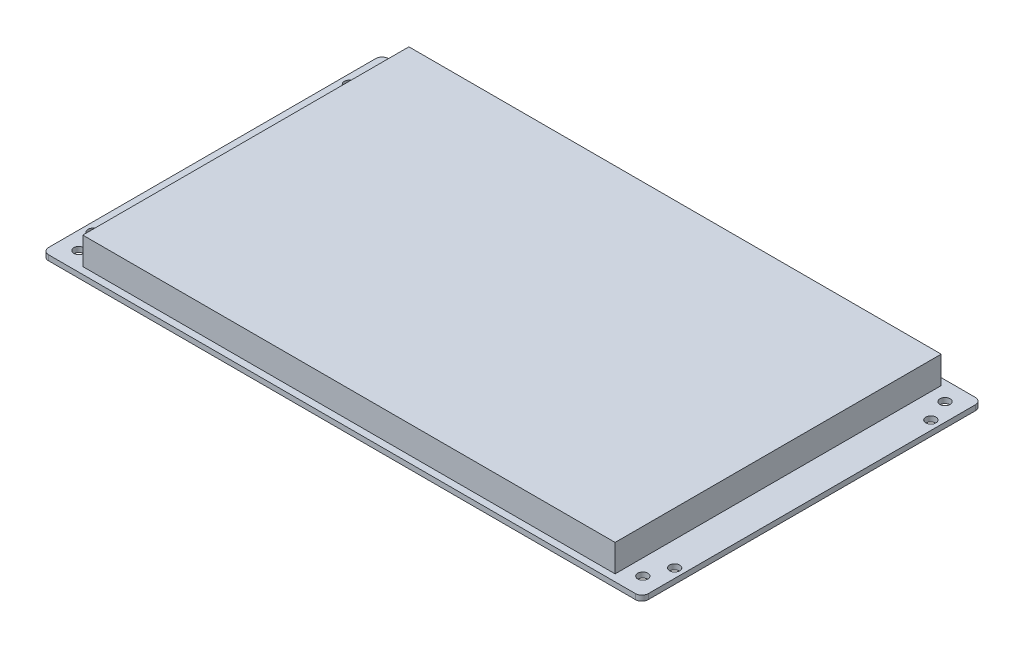
ISO-10303-21;
HEADER;
FILE_DESCRIPTION(('STEP AP214'),'2;1');
FILE_NAME('part.step','',(''),(''),'','','');
FILE_SCHEMA(('AUTOMOTIVE_DESIGN { 1 0 10303 214 1 1 1 1 }'));
ENDSEC;
DATA;
#1=APPLICATION_CONTEXT('core data for automotive mechanical design processes');
#2=APPLICATION_PROTOCOL_DEFINITION('international standard','automotive_design',2000,#1);
#3=PRODUCT_CONTEXT('',#1,'mechanical');
#4=PRODUCT('Part','Part','',(#3));
#5=PRODUCT_RELATED_PRODUCT_CATEGORY('part','',(#4));
#6=PRODUCT_DEFINITION_FORMATION('','',#4);
#7=PRODUCT_DEFINITION_CONTEXT('part definition',#1,'design');
#8=PRODUCT_DEFINITION('design','',#6,#7);
#9=PRODUCT_DEFINITION_SHAPE('','',#8);
#10=(LENGTH_UNIT() NAMED_UNIT(*) SI_UNIT(.MILLI.,.METRE.));
#11=(NAMED_UNIT(*) PLANE_ANGLE_UNIT() SI_UNIT($,.RADIAN.));
#12=(NAMED_UNIT(*) SI_UNIT($,.STERADIAN.) SOLID_ANGLE_UNIT());
#13=UNCERTAINTY_MEASURE_WITH_UNIT(LENGTH_MEASURE(1.E-05),#10,'distance_accuracy_value','');
#14=(GEOMETRIC_REPRESENTATION_CONTEXT(3) GLOBAL_UNCERTAINTY_ASSIGNED_CONTEXT((#13)) GLOBAL_UNIT_ASSIGNED_CONTEXT((#10,
#11,#12)) REPRESENTATION_CONTEXT('',''));
#15=CARTESIAN_POINT('',(0.,0.,0.));
#16=DIRECTION('',(0.,0.,1.));
#17=DIRECTION('',(1.,0.,0.));
#18=AXIS2_PLACEMENT_3D('',#15,#16,#17);
#19=CARTESIAN_POINT('',(-83.,10.14,-50.85));
#20=DIRECTION('',(1.,0.,0.));
#21=DIRECTION('',(0.,0.,-1.));
#22=AXIS2_PLACEMENT_3D('',#19,#20,#21);
#23=PLANE('',#22);
#24=DIRECTION('',(0.,0.,1.));
#25=VECTOR('',#24,1.);
#26=CARTESIAN_POINT('',(-83.,1.64,-50.85));
#27=LINE('',#26,#25);
#28=CARTESIAN_POINT('',(-83.,1.64,-50.85));
#29=VERTEX_POINT('',#28);
#30=CARTESIAN_POINT('',(-83.,1.64,50.85));
#31=VERTEX_POINT('',#30);
#32=EDGE_CURVE('E107',#29,#31,#27,.T.);
#33=ORIENTED_EDGE('',*,*,#32,.T.);
#34=DIRECTION('',(0.,-1.,0.));
#35=VECTOR('',#34,1.);
#36=CARTESIAN_POINT('',(-83.,10.14,50.85));
#37=LINE('',#36,#35);
#38=CARTESIAN_POINT('',(-83.,10.14,50.85));
#39=VERTEX_POINT('',#38);
#40=EDGE_CURVE('E12',#39,#31,#37,.T.);
#41=ORIENTED_EDGE('',*,*,#40,.F.);
#42=DIRECTION('',(0.,0.,1.));
#43=VECTOR('',#42,1.);
#44=CARTESIAN_POINT('',(-83.,10.14,-50.85));
#45=LINE('',#44,#43);
#46=CARTESIAN_POINT('',(-83.,10.14,-50.85));
#47=VERTEX_POINT('',#46);
#48=EDGE_CURVE('E95',#47,#39,#45,.T.);
#49=ORIENTED_EDGE('',*,*,#48,.F.);
#50=DIRECTION('',(0.,-1.,0.));
#51=VECTOR('',#50,1.);
#52=CARTESIAN_POINT('',(-83.,10.14,-50.85));
#53=LINE('',#52,#51);
#54=EDGE_CURVE('E103',#47,#29,#53,.T.);
#55=ORIENTED_EDGE('',*,*,#54,.T.);
#56=EDGE_LOOP('',(#33,#41,#49,#55));
#57=FACE_BOUND('',#56,.T.);
#58=ADVANCED_FACE('F44',(#57),#23,.F.);
#59=CARTESIAN_POINT('',(83.,10.14,50.85));
#60=DIRECTION('',(0.,0.,-1.));
#61=DIRECTION('',(-1.,0.,0.));
#62=AXIS2_PLACEMENT_3D('',#59,#60,#61);
#63=PLANE('',#62);
#64=DIRECTION('',(1.,0.,0.));
#65=VECTOR('',#64,1.);
#66=CARTESIAN_POINT('',(83.,1.64,50.85));
#67=LINE('',#66,#65);
#68=CARTESIAN_POINT('',(83.,1.64,50.85));
#69=VERTEX_POINT('',#68);
#70=EDGE_CURVE('E99',#31,#69,#67,.T.);
#71=ORIENTED_EDGE('',*,*,#70,.T.);
#72=DIRECTION('',(0.,-1.,0.));
#73=VECTOR('',#72,1.);
#74=CARTESIAN_POINT('',(83.,10.14,50.85));
#75=LINE('',#74,#73);
#76=CARTESIAN_POINT('',(83.,10.14,50.85));
#77=VERTEX_POINT('',#76);
#78=EDGE_CURVE('E52',#77,#69,#75,.T.);
#79=ORIENTED_EDGE('',*,*,#78,.F.);
#80=DIRECTION('',(1.,0.,0.));
#81=VECTOR('',#80,1.);
#82=CARTESIAN_POINT('',(83.,10.14,50.85));
#83=LINE('',#82,#81);
#84=EDGE_CURVE('E90',#39,#77,#83,.T.);
#85=ORIENTED_EDGE('',*,*,#84,.F.);
#86=ORIENTED_EDGE('',*,*,#40,.T.);
#87=EDGE_LOOP('',(#71,#79,#85,#86));
#88=FACE_BOUND('',#87,.T.);
#89=ADVANCED_FACE('F98',(#88),#63,.F.);
#90=CARTESIAN_POINT('',(83.,10.14,-50.85));
#91=DIRECTION('',(-1.,0.,0.));
#92=DIRECTION('',(0.,0.,1.));
#93=AXIS2_PLACEMENT_3D('',#90,#91,#92);
#94=PLANE('',#93);
#95=DIRECTION('',(0.,0.,-1.));
#96=VECTOR('',#95,1.);
#97=CARTESIAN_POINT('',(83.,1.64,-50.85));
#98=LINE('',#97,#96);
#99=CARTESIAN_POINT('',(83.,1.64,-50.85));
#100=VERTEX_POINT('',#99);
#101=EDGE_CURVE('E77',#69,#100,#98,.T.);
#102=ORIENTED_EDGE('',*,*,#101,.T.);
#103=DIRECTION('',(0.,-1.,0.));
#104=VECTOR('',#103,1.);
#105=CARTESIAN_POINT('',(83.,10.14,-50.85));
#106=LINE('',#105,#104);
#107=CARTESIAN_POINT('',(83.,10.14,-50.85));
#108=VERTEX_POINT('',#107);
#109=EDGE_CURVE('E100',#108,#100,#106,.T.);
#110=ORIENTED_EDGE('',*,*,#109,.F.);
#111=DIRECTION('',(0.,0.,-1.));
#112=VECTOR('',#111,1.);
#113=CARTESIAN_POINT('',(83.,10.14,-50.85));
#114=LINE('',#113,#112);
#115=EDGE_CURVE('E93',#77,#108,#114,.T.);
#116=ORIENTED_EDGE('',*,*,#115,.F.);
#117=ORIENTED_EDGE('',*,*,#78,.T.);
#118=EDGE_LOOP('',(#102,#110,#116,#117));
#119=FACE_BOUND('',#118,.T.);
#120=ADVANCED_FACE('F101',(#119),#94,.F.);
#121=CARTESIAN_POINT('',(83.,10.14,-50.85));
#122=DIRECTION('',(0.,0.,1.));
#123=DIRECTION('',(1.,0.,0.));
#124=AXIS2_PLACEMENT_3D('',#121,#122,#123);
#125=PLANE('',#124);
#126=DIRECTION('',(-1.,0.,0.));
#127=VECTOR('',#126,1.);
#128=CARTESIAN_POINT('',(83.,1.64,-50.85));
#129=LINE('',#128,#127);
#130=EDGE_CURVE('E83',#100,#29,#129,.T.);
#131=ORIENTED_EDGE('',*,*,#130,.T.);
#132=ORIENTED_EDGE('',*,*,#54,.F.);
#133=DIRECTION('',(-1.,0.,0.));
#134=VECTOR('',#133,1.);
#135=CARTESIAN_POINT('',(83.,10.14,-50.85));
#136=LINE('',#135,#134);
#137=EDGE_CURVE('E60',#108,#47,#136,.T.);
#138=ORIENTED_EDGE('',*,*,#137,.F.);
#139=ORIENTED_EDGE('',*,*,#109,.T.);
#140=EDGE_LOOP('',(#131,#132,#138,#139));
#141=FACE_BOUND('',#140,.T.);
#142=ADVANCED_FACE('F114',(#141),#125,.F.);
#143=CARTESIAN_POINT('',(0.,10.14,0.));
#144=DIRECTION('',(0.,-1.,0.));
#145=DIRECTION('',(0.,0.,-1.));
#146=AXIS2_PLACEMENT_3D('',#143,#144,#145);
#147=PLANE('',#146);
#148=ORIENTED_EDGE('',*,*,#48,.T.);
#149=ORIENTED_EDGE('',*,*,#84,.T.);
#150=ORIENTED_EDGE('',*,*,#115,.T.);
#151=ORIENTED_EDGE('',*,*,#137,.T.);
#152=EDGE_LOOP('',(#148,#149,#150,#151));
#153=FACE_BOUND('',#152,.T.);
#154=ADVANCED_FACE('F91',(#153),#147,.F.);
#155=CARTESIAN_POINT('',(0.,1.64,0.));
#156=DIRECTION('',(0.,-1.,0.));
#157=DIRECTION('',(0.,0.,-1.));
#158=AXIS2_PLACEMENT_3D('',#155,#156,#157);
#159=PLANE('',#158);
#160=ORIENTED_EDGE('',*,*,#32,.F.);
#161=ORIENTED_EDGE('',*,*,#130,.F.);
#162=ORIENTED_EDGE('',*,*,#101,.F.);
#163=ORIENTED_EDGE('',*,*,#70,.F.);
#164=EDGE_LOOP('',(#160,#161,#162,#163));
#165=FACE_BOUND('',#164,.T.);
#166=ADVANCED_FACE('F117',(#165),#159,.T.);
#167=CLOSED_SHELL('',(#58,#89,#120,#142,#154,#166));
#168=MANIFOLD_SOLID_BREP('B2',#167);
#169=CARTESIAN_POINT('',(-93.5,1.64,-53.));
#170=DIRECTION('',(1.,0.,0.));
#171=DIRECTION('',(0.,0.,-1.));
#172=AXIS2_PLACEMENT_3D('',#169,#170,#171);
#173=PLANE('',#172);
#174=DIRECTION('',(0.,0.,1.));
#175=VECTOR('',#174,1.);
#176=CARTESIAN_POINT('',(-93.5,1.64,-53.));
#177=LINE('',#176,#175);
#178=CARTESIAN_POINT('',(-93.5,1.64,-51.));
#179=VERTEX_POINT('',#178);
#180=CARTESIAN_POINT('',(-93.5,1.64,51.));
#181=VERTEX_POINT('',#180);
#182=EDGE_CURVE('E254',#179,#181,#177,.T.);
#183=ORIENTED_EDGE('',*,*,#182,.F.);
#184=DIRECTION('',(0.,-1.,0.));
#185=VECTOR('',#184,1.);
#186=CARTESIAN_POINT('',(-93.5,1.64,-51.));
#187=LINE('',#186,#185);
#188=CARTESIAN_POINT('',(-93.5,0.,-51.));
#189=VERTEX_POINT('',#188);
#190=EDGE_CURVE('E239',#179,#189,#187,.T.);
#191=ORIENTED_EDGE('',*,*,#190,.T.);
#192=DIRECTION('',(0.,0.,1.));
#193=VECTOR('',#192,1.);
#194=CARTESIAN_POINT('',(-93.5,0.,-53.));
#195=LINE('',#194,#193);
#196=CARTESIAN_POINT('',(-93.5,0.,51.));
#197=VERTEX_POINT('',#196);
#198=EDGE_CURVE('E251',#189,#197,#195,.T.);
#199=ORIENTED_EDGE('',*,*,#198,.T.);
#200=DIRECTION('',(0.,-1.,0.));
#201=VECTOR('',#200,1.);
#202=CARTESIAN_POINT('',(-93.5,1.64,51.));
#203=LINE('',#202,#201);
#204=EDGE_CURVE('E256',#197,#181,#203,.F.);
#205=ORIENTED_EDGE('',*,*,#204,.T.);
#206=EDGE_LOOP('',(#183,#191,#199,#205));
#207=FACE_BOUND('',#206,.T.);
#208=ADVANCED_FACE('F167',(#207),#173,.F.);
#209=CARTESIAN_POINT('',(93.5,1.64,53.));
#210=DIRECTION('',(0.,0.,-1.));
#211=DIRECTION('',(-1.,0.,0.));
#212=AXIS2_PLACEMENT_3D('',#209,#210,#211);
#213=PLANE('',#212);
#214=DIRECTION('',(1.,0.,0.));
#215=VECTOR('',#214,1.);
#216=CARTESIAN_POINT('',(93.5,1.64,53.));
#217=LINE('',#216,#215);
#218=CARTESIAN_POINT('',(-91.5,1.64,53.));
#219=VERTEX_POINT('',#218);
#220=CARTESIAN_POINT('',(91.5,1.64,53.));
#221=VERTEX_POINT('',#220);
#222=EDGE_CURVE('E354',#219,#221,#217,.T.);
#223=ORIENTED_EDGE('',*,*,#222,.F.);
#224=DIRECTION('',(0.,-1.,0.));
#225=VECTOR('',#224,1.);
#226=CARTESIAN_POINT('',(-91.5,1.64,53.));
#227=LINE('',#226,#225);
#228=CARTESIAN_POINT('',(-91.5,0.,53.));
#229=VERTEX_POINT('',#228);
#230=EDGE_CURVE('E291',#219,#229,#227,.T.);
#231=ORIENTED_EDGE('',*,*,#230,.T.);
#232=DIRECTION('',(1.,0.,0.));
#233=VECTOR('',#232,1.);
#234=CARTESIAN_POINT('',(93.5,0.,53.));
#235=LINE('',#234,#233);
#236=CARTESIAN_POINT('',(91.5,0.,53.));
#237=VERTEX_POINT('',#236);
#238=EDGE_CURVE('E260',#229,#237,#235,.T.);
#239=ORIENTED_EDGE('',*,*,#238,.T.);
#240=DIRECTION('',(0.,-1.,0.));
#241=VECTOR('',#240,1.);
#242=CARTESIAN_POINT('',(91.5,1.64,53.));
#243=LINE('',#242,#241);
#244=EDGE_CURVE('E289',#237,#221,#243,.F.);
#245=ORIENTED_EDGE('',*,*,#244,.T.);
#246=EDGE_LOOP('',(#223,#231,#239,#245));
#247=FACE_BOUND('',#246,.T.);
#248=ADVANCED_FACE('F371',(#247),#213,.F.);
#249=CARTESIAN_POINT('',(93.5,1.64,-53.));
#250=DIRECTION('',(-1.,0.,0.));
#251=DIRECTION('',(0.,0.,1.));
#252=AXIS2_PLACEMENT_3D('',#249,#250,#251);
#253=PLANE('',#252);
#254=DIRECTION('',(0.,0.,-1.));
#255=VECTOR('',#254,1.);
#256=CARTESIAN_POINT('',(93.5,1.64,-53.));
#257=LINE('',#256,#255);
#258=CARTESIAN_POINT('',(93.5,1.64,51.));
#259=VERTEX_POINT('',#258);
#260=CARTESIAN_POINT('',(93.5,1.64,-51.));
#261=VERTEX_POINT('',#260);
#262=EDGE_CURVE('E355',#259,#261,#257,.T.);
#263=ORIENTED_EDGE('',*,*,#262,.F.);
#264=DIRECTION('',(0.,-1.,0.));
#265=VECTOR('',#264,1.);
#266=CARTESIAN_POINT('',(93.5,1.64,51.));
#267=LINE('',#266,#265);
#268=CARTESIAN_POINT('',(93.5,0.,51.));
#269=VERTEX_POINT('',#268);
#270=EDGE_CURVE('E42',#259,#269,#267,.T.);
#271=ORIENTED_EDGE('',*,*,#270,.T.);
#272=DIRECTION('',(0.,0.,-1.));
#273=VECTOR('',#272,1.);
#274=CARTESIAN_POINT('',(93.5,0.,-53.));
#275=LINE('',#274,#273);
#276=CARTESIAN_POINT('',(93.5,0.,-51.));
#277=VERTEX_POINT('',#276);
#278=EDGE_CURVE('E263',#269,#277,#275,.T.);
#279=ORIENTED_EDGE('',*,*,#278,.T.);
#280=DIRECTION('',(0.,-1.,0.));
#281=VECTOR('',#280,1.);
#282=CARTESIAN_POINT('',(93.5,1.64,-51.));
#283=LINE('',#282,#281);
#284=EDGE_CURVE('E176',#277,#261,#283,.F.);
#285=ORIENTED_EDGE('',*,*,#284,.T.);
#286=EDGE_LOOP('',(#263,#271,#279,#285));
#287=FACE_BOUND('',#286,.T.);
#288=ADVANCED_FACE('F364',(#287),#253,.F.);
#289=CARTESIAN_POINT('',(93.5,1.64,-53.));
#290=DIRECTION('',(0.,0.,1.));
#291=DIRECTION('',(1.,0.,0.));
#292=AXIS2_PLACEMENT_3D('',#289,#290,#291);
#293=PLANE('',#292);
#294=DIRECTION('',(-1.,0.,0.));
#295=VECTOR('',#294,1.);
#296=CARTESIAN_POINT('',(93.5,0.,-53.));
#297=LINE('',#296,#295);
#298=CARTESIAN_POINT('',(91.5,0.,-53.));
#299=VERTEX_POINT('',#298);
#300=CARTESIAN_POINT('',(-91.5,0.,-53.));
#301=VERTEX_POINT('',#300);
#302=EDGE_CURVE('E272',#299,#301,#297,.T.);
#303=ORIENTED_EDGE('',*,*,#302,.T.);
#304=DIRECTION('',(0.,-1.,0.));
#305=VECTOR('',#304,1.);
#306=CARTESIAN_POINT('',(-91.5,1.64,-53.));
#307=LINE('',#306,#305);
#308=CARTESIAN_POINT('',(-91.5,1.64,-53.));
#309=VERTEX_POINT('',#308);
#310=EDGE_CURVE('E240',#301,#309,#307,.F.);
#311=ORIENTED_EDGE('',*,*,#310,.T.);
#312=DIRECTION('',(-1.,0.,0.));
#313=VECTOR('',#312,1.);
#314=CARTESIAN_POINT('',(93.5,1.64,-53.));
#315=LINE('',#314,#313);
#316=CARTESIAN_POINT('',(91.5,1.64,-53.));
#317=VERTEX_POINT('',#316);
#318=EDGE_CURVE('E268',#317,#309,#315,.T.);
#319=ORIENTED_EDGE('',*,*,#318,.F.);
#320=DIRECTION('',(0.,-1.,0.));
#321=VECTOR('',#320,1.);
#322=CARTESIAN_POINT('',(91.5,1.64,-53.));
#323=LINE('',#322,#321);
#324=EDGE_CURVE('E245',#317,#299,#323,.T.);
#325=ORIENTED_EDGE('',*,*,#324,.T.);
#326=EDGE_LOOP('',(#303,#311,#319,#325));
#327=FACE_BOUND('',#326,.T.);
#328=ADVANCED_FACE('F361',(#327),#293,.F.);
#329=CARTESIAN_POINT('',(0.,1.64,0.));
#330=DIRECTION('',(0.,-1.,0.));
#331=DIRECTION('',(0.,0.,-1.));
#332=AXIS2_PLACEMENT_3D('',#329,#330,#331);
#333=PLANE('',#332);
#334=CARTESIAN_POINT('',(90.675,1.64,-39.95));
#335=DIRECTION('',(0.,1.,0.));
#336=DIRECTION('',(0.,0.,1.));
#337=AXIS2_PLACEMENT_3D('',#334,#335,#336);
#338=CIRCLE('',#337,1.57499999999999);
#339=CARTESIAN_POINT('',(90.675,1.64,-38.375));
#340=VERTEX_POINT('',#339);
#341=EDGE_CURVE('E344',#340,#340,#338,.T.);
#342=ORIENTED_EDGE('',*,*,#341,.F.);
#343=EDGE_LOOP('',(#342));
#344=FACE_BOUND('',#343,.T.);
#345=CARTESIAN_POINT('',(90.675,1.64,39.95));
#346=DIRECTION('',(0.,1.,0.));
#347=DIRECTION('',(0.,0.,1.));
#348=AXIS2_PLACEMENT_3D('',#345,#346,#347);
#349=CIRCLE('',#348,1.57500000000001);
#350=CARTESIAN_POINT('',(90.675,1.64,41.525));
#351=VERTEX_POINT('',#350);
#352=EDGE_CURVE('E347',#351,#351,#349,.T.);
#353=ORIENTED_EDGE('',*,*,#352,.F.);
#354=EDGE_LOOP('',(#353));
#355=FACE_BOUND('',#354,.T.);
#356=CARTESIAN_POINT('',(87.925,1.64,47.125));
#357=DIRECTION('',(0.,1.,0.));
#358=DIRECTION('',(0.,0.,1.));
#359=AXIS2_PLACEMENT_3D('',#356,#357,#358);
#360=CIRCLE('',#359,1.57500000000001);
#361=CARTESIAN_POINT('',(87.925,1.64,48.7));
#362=VERTEX_POINT('',#361);
#363=EDGE_CURVE('E437',#362,#362,#360,.T.);
#364=ORIENTED_EDGE('',*,*,#363,.F.);
#365=EDGE_LOOP('',(#364));
#366=FACE_BOUND('',#365,.T.);
#367=CARTESIAN_POINT('',(-87.925,1.64,47.125));
#368=DIRECTION('',(0.,1.,0.));
#369=DIRECTION('',(0.,0.,1.));
#370=AXIS2_PLACEMENT_3D('',#367,#368,#369);
#371=CIRCLE('',#370,1.57500000000001);
#372=CARTESIAN_POINT('',(-87.925,1.64,48.7));
#373=VERTEX_POINT('',#372);
#374=EDGE_CURVE('E351',#373,#373,#371,.T.);
#375=ORIENTED_EDGE('',*,*,#374,.F.);
#376=EDGE_LOOP('',(#375));
#377=FACE_BOUND('',#376,.T.);
#378=CARTESIAN_POINT('',(-90.675,1.64,-39.95));
#379=DIRECTION('',(0.,1.,0.));
#380=DIRECTION('',(0.,0.,1.));
#381=AXIS2_PLACEMENT_3D('',#378,#379,#380);
#382=CIRCLE('',#381,1.57500000000001);
#383=CARTESIAN_POINT('',(-90.675,1.64,-38.375));
#384=VERTEX_POINT('',#383);
#385=EDGE_CURVE('E426',#384,#384,#382,.T.);
#386=ORIENTED_EDGE('',*,*,#385,.F.);
#387=EDGE_LOOP('',(#386));
#388=FACE_BOUND('',#387,.T.);
#389=CARTESIAN_POINT('',(-87.925,1.64,-47.125));
#390=DIRECTION('',(0.,1.,0.));
#391=DIRECTION('',(0.,0.,1.));
#392=AXIS2_PLACEMENT_3D('',#389,#390,#391);
#393=CIRCLE('',#392,1.57500000000001);
#394=CARTESIAN_POINT('',(-87.925,1.64,-45.55));
#395=VERTEX_POINT('',#394);
#396=EDGE_CURVE('E428',#395,#395,#393,.T.);
#397=ORIENTED_EDGE('',*,*,#396,.F.);
#398=EDGE_LOOP('',(#397));
#399=FACE_BOUND('',#398,.T.);
#400=CARTESIAN_POINT('',(-90.675,1.64,39.95));
#401=DIRECTION('',(0.,1.,0.));
#402=DIRECTION('',(0.,0.,1.));
#403=AXIS2_PLACEMENT_3D('',#400,#401,#402);
#404=CIRCLE('',#403,1.57500000000001);
#405=CARTESIAN_POINT('',(-90.675,1.64,41.525));
#406=VERTEX_POINT('',#405);
#407=EDGE_CURVE('E431',#406,#406,#404,.T.);
#408=ORIENTED_EDGE('',*,*,#407,.F.);
#409=EDGE_LOOP('',(#408));
#410=FACE_BOUND('',#409,.T.);
#411=CARTESIAN_POINT('',(87.925,1.64,-47.125));
#412=DIRECTION('',(0.,1.,0.));
#413=DIRECTION('',(0.,0.,1.));
#414=AXIS2_PLACEMENT_3D('',#411,#412,#413);
#415=CIRCLE('',#414,1.57499999999999);
#416=CARTESIAN_POINT('',(87.925,1.64,-45.55));
#417=VERTEX_POINT('',#416);
#418=EDGE_CURVE('E299',#417,#417,#415,.T.);
#419=ORIENTED_EDGE('',*,*,#418,.F.);
#420=EDGE_LOOP('',(#419));
#421=FACE_BOUND('',#420,.T.);
#422=ORIENTED_EDGE('',*,*,#318,.T.);
#423=CARTESIAN_POINT('',(-91.5,1.64,-51.));
#424=DIRECTION('',(0.,-1.,0.));
#425=DIRECTION('',(0.,0.,-1.));
#426=AXIS2_PLACEMENT_3D('',#423,#424,#425);
#427=CIRCLE('',#426,2.);
#428=EDGE_CURVE('E287',#309,#179,#427,.F.);
#429=ORIENTED_EDGE('',*,*,#428,.T.);
#430=ORIENTED_EDGE('',*,*,#182,.T.);
#431=CARTESIAN_POINT('',(-91.5,1.64,51.));
#432=DIRECTION('',(0.,-1.,0.));
#433=DIRECTION('',(0.,0.,-1.));
#434=AXIS2_PLACEMENT_3D('',#431,#432,#433);
#435=CIRCLE('',#434,2.);
#436=EDGE_CURVE('E285',#181,#219,#435,.F.);
#437=ORIENTED_EDGE('',*,*,#436,.T.);
#438=ORIENTED_EDGE('',*,*,#222,.T.);
#439=CARTESIAN_POINT('',(91.5,1.64,51.));
#440=DIRECTION('',(0.,-1.,0.));
#441=DIRECTION('',(0.,0.,-1.));
#442=AXIS2_PLACEMENT_3D('',#439,#440,#441);
#443=CIRCLE('',#442,2.);
#444=EDGE_CURVE('E190',#221,#259,#443,.F.);
#445=ORIENTED_EDGE('',*,*,#444,.T.);
#446=ORIENTED_EDGE('',*,*,#262,.T.);
#447=CARTESIAN_POINT('',(91.5,1.64,-51.));
#448=DIRECTION('',(0.,-1.,0.));
#449=DIRECTION('',(0.,0.,-1.));
#450=AXIS2_PLACEMENT_3D('',#447,#448,#449);
#451=CIRCLE('',#450,2.);
#452=EDGE_CURVE('E282',#261,#317,#451,.F.);
#453=ORIENTED_EDGE('',*,*,#452,.T.);
#454=EDGE_LOOP('',(#422,#429,#430,#437,#438,#445,#446,#453));
#455=FACE_BOUND('',#454,.T.);
#456=ADVANCED_FACE('F321',(#344,#355,#366,#377,#388,#399,#410,#421,#455),#333,.F.);
#457=CARTESIAN_POINT('',(0.,0.,0.));
#458=DIRECTION('',(0.,-1.,0.));
#459=DIRECTION('',(0.,0.,-1.));
#460=AXIS2_PLACEMENT_3D('',#457,#458,#459);
#461=PLANE('',#460);
#462=CARTESIAN_POINT('',(90.675,0.,-39.95));
#463=DIRECTION('',(0.,-1.,0.));
#464=DIRECTION('',(0.,0.,-1.));
#465=AXIS2_PLACEMENT_3D('',#462,#463,#464);
#466=CIRCLE('',#465,1.57499999999999);
#467=CARTESIAN_POINT('',(90.675,0.,-41.525));
#468=VERTEX_POINT('',#467);
#469=EDGE_CURVE('E171',#468,#468,#466,.T.);
#470=ORIENTED_EDGE('',*,*,#469,.F.);
#471=EDGE_LOOP('',(#470));
#472=FACE_BOUND('',#471,.T.);
#473=CARTESIAN_POINT('',(90.675,0.,39.95));
#474=DIRECTION('',(0.,-1.,0.));
#475=DIRECTION('',(0.,0.,-1.));
#476=AXIS2_PLACEMENT_3D('',#473,#474,#475);
#477=CIRCLE('',#476,1.57500000000001);
#478=CARTESIAN_POINT('',(90.675,0.,38.375));
#479=VERTEX_POINT('',#478);
#480=EDGE_CURVE('E266',#479,#479,#477,.T.);
#481=ORIENTED_EDGE('',*,*,#480,.F.);
#482=EDGE_LOOP('',(#481));
#483=FACE_BOUND('',#482,.T.);
#484=CARTESIAN_POINT('',(87.925,0.,47.125));
#485=DIRECTION('',(0.,-1.,0.));
#486=DIRECTION('',(0.,0.,-1.));
#487=AXIS2_PLACEMENT_3D('',#484,#485,#486);
#488=CIRCLE('',#487,1.57500000000001);
#489=CARTESIAN_POINT('',(87.925,0.,45.55));
#490=VERTEX_POINT('',#489);
#491=EDGE_CURVE('E311',#490,#490,#488,.T.);
#492=ORIENTED_EDGE('',*,*,#491,.F.);
#493=EDGE_LOOP('',(#492));
#494=FACE_BOUND('',#493,.T.);
#495=CARTESIAN_POINT('',(-87.925,0.,47.125));
#496=DIRECTION('',(0.,-1.,0.));
#497=DIRECTION('',(0.,0.,-1.));
#498=AXIS2_PLACEMENT_3D('',#495,#496,#497);
#499=CIRCLE('',#498,1.57500000000001);
#500=CARTESIAN_POINT('',(-87.925,0.,45.55));
#501=VERTEX_POINT('',#500);
#502=EDGE_CURVE('E308',#501,#501,#499,.T.);
#503=ORIENTED_EDGE('',*,*,#502,.F.);
#504=EDGE_LOOP('',(#503));
#505=FACE_BOUND('',#504,.T.);
#506=CARTESIAN_POINT('',(-90.675,0.,-39.95));
#507=DIRECTION('',(0.,-1.,0.));
#508=DIRECTION('',(0.,0.,-1.));
#509=AXIS2_PLACEMENT_3D('',#506,#507,#508);
#510=CIRCLE('',#509,1.57500000000001);
#511=CARTESIAN_POINT('',(-90.675,0.,-41.525));
#512=VERTEX_POINT('',#511);
#513=EDGE_CURVE('E305',#512,#512,#510,.T.);
#514=ORIENTED_EDGE('',*,*,#513,.F.);
#515=EDGE_LOOP('',(#514));
#516=FACE_BOUND('',#515,.T.);
#517=CARTESIAN_POINT('',(-87.925,0.,-47.125));
#518=DIRECTION('',(0.,-1.,0.));
#519=DIRECTION('',(0.,0.,-1.));
#520=AXIS2_PLACEMENT_3D('',#517,#518,#519);
#521=CIRCLE('',#520,1.57500000000001);
#522=CARTESIAN_POINT('',(-87.925,0.,-48.7));
#523=VERTEX_POINT('',#522);
#524=EDGE_CURVE('E302',#523,#523,#521,.T.);
#525=ORIENTED_EDGE('',*,*,#524,.F.);
#526=EDGE_LOOP('',(#525));
#527=FACE_BOUND('',#526,.T.);
#528=CARTESIAN_POINT('',(-90.675,0.,39.95));
#529=DIRECTION('',(0.,-1.,0.));
#530=DIRECTION('',(0.,0.,-1.));
#531=AXIS2_PLACEMENT_3D('',#528,#529,#530);
#532=CIRCLE('',#531,1.57500000000001);
#533=CARTESIAN_POINT('',(-90.675,0.,38.375));
#534=VERTEX_POINT('',#533);
#535=EDGE_CURVE('E298',#534,#534,#532,.T.);
#536=ORIENTED_EDGE('',*,*,#535,.F.);
#537=EDGE_LOOP('',(#536));
#538=FACE_BOUND('',#537,.T.);
#539=CARTESIAN_POINT('',(87.925,0.,-47.125));
#540=DIRECTION('',(0.,-1.,0.));
#541=DIRECTION('',(0.,0.,-1.));
#542=AXIS2_PLACEMENT_3D('',#539,#540,#541);
#543=CIRCLE('',#542,1.57499999999999);
#544=CARTESIAN_POINT('',(87.925,0.,-48.7));
#545=VERTEX_POINT('',#544);
#546=EDGE_CURVE('E295',#545,#545,#543,.T.);
#547=ORIENTED_EDGE('',*,*,#546,.F.);
#548=EDGE_LOOP('',(#547));
#549=FACE_BOUND('',#548,.T.);
#550=ORIENTED_EDGE('',*,*,#198,.F.);
#551=CARTESIAN_POINT('',(-91.5,0.,-51.));
#552=DIRECTION('',(0.,-1.,0.));
#553=DIRECTION('',(0.,0.,-1.));
#554=AXIS2_PLACEMENT_3D('',#551,#552,#553);
#555=CIRCLE('',#554,2.);
#556=EDGE_CURVE('E235',#189,#301,#555,.T.);
#557=ORIENTED_EDGE('',*,*,#556,.T.);
#558=ORIENTED_EDGE('',*,*,#302,.F.);
#559=CARTESIAN_POINT('',(91.5,0.,-51.));
#560=DIRECTION('',(0.,-1.,0.));
#561=DIRECTION('',(0.,0.,-1.));
#562=AXIS2_PLACEMENT_3D('',#559,#560,#561);
#563=CIRCLE('',#562,2.);
#564=EDGE_CURVE('E255',#299,#277,#563,.T.);
#565=ORIENTED_EDGE('',*,*,#564,.T.);
#566=ORIENTED_EDGE('',*,*,#278,.F.);
#567=CARTESIAN_POINT('',(91.5,0.,51.));
#568=DIRECTION('',(0.,-1.,0.));
#569=DIRECTION('',(0.,0.,-1.));
#570=AXIS2_PLACEMENT_3D('',#567,#568,#569);
#571=CIRCLE('',#570,2.);
#572=EDGE_CURVE('E276',#269,#237,#571,.T.);
#573=ORIENTED_EDGE('',*,*,#572,.T.);
#574=ORIENTED_EDGE('',*,*,#238,.F.);
#575=CARTESIAN_POINT('',(-91.5,0.,51.));
#576=DIRECTION('',(0.,-1.,0.));
#577=DIRECTION('',(0.,0.,-1.));
#578=AXIS2_PLACEMENT_3D('',#575,#576,#577);
#579=CIRCLE('',#578,2.);
#580=EDGE_CURVE('E246',#229,#197,#579,.T.);
#581=ORIENTED_EDGE('',*,*,#580,.T.);
#582=EDGE_LOOP('',(#550,#557,#558,#565,#566,#573,#574,#581));
#583=FACE_BOUND('',#582,.T.);
#584=ADVANCED_FACE('F258',(#472,#483,#494,#505,#516,#527,#538,#549,#583),#461,.T.);
#585=CARTESIAN_POINT('',(-91.5,1.64,-51.));
#586=DIRECTION('',(0.,-1.,0.));
#587=DIRECTION('',(0.,0.,-1.));
#588=AXIS2_PLACEMENT_3D('',#585,#586,#587);
#589=CYLINDRICAL_SURFACE('',#588,2.);
#590=ORIENTED_EDGE('',*,*,#428,.F.);
#591=ORIENTED_EDGE('',*,*,#310,.F.);
#592=ORIENTED_EDGE('',*,*,#556,.F.);
#593=ORIENTED_EDGE('',*,*,#190,.F.);
#594=EDGE_LOOP('',(#590,#591,#592,#593));
#595=FACE_BOUND('',#594,.T.);
#596=ADVANCED_FACE('F238',(#595),#589,.T.);
#597=CARTESIAN_POINT('',(-91.5,1.64,51.));
#598=DIRECTION('',(0.,-1.,0.));
#599=DIRECTION('',(0.,0.,-1.));
#600=AXIS2_PLACEMENT_3D('',#597,#598,#599);
#601=CYLINDRICAL_SURFACE('',#600,2.);
#602=ORIENTED_EDGE('',*,*,#436,.F.);
#603=ORIENTED_EDGE('',*,*,#204,.F.);
#604=ORIENTED_EDGE('',*,*,#580,.F.);
#605=ORIENTED_EDGE('',*,*,#230,.F.);
#606=EDGE_LOOP('',(#602,#603,#604,#605));
#607=FACE_BOUND('',#606,.T.);
#608=ADVANCED_FACE('F375',(#607),#601,.T.);
#609=CARTESIAN_POINT('',(91.5,1.64,51.));
#610=DIRECTION('',(0.,-1.,0.));
#611=DIRECTION('',(0.,0.,-1.));
#612=AXIS2_PLACEMENT_3D('',#609,#610,#611);
#613=CYLINDRICAL_SURFACE('',#612,2.);
#614=ORIENTED_EDGE('',*,*,#444,.F.);
#615=ORIENTED_EDGE('',*,*,#244,.F.);
#616=ORIENTED_EDGE('',*,*,#572,.F.);
#617=ORIENTED_EDGE('',*,*,#270,.F.);
#618=EDGE_LOOP('',(#614,#615,#616,#617));
#619=FACE_BOUND('',#618,.T.);
#620=ADVANCED_FACE('F367',(#619),#613,.T.);
#621=CARTESIAN_POINT('',(91.5,1.64,-51.));
#622=DIRECTION('',(0.,-1.,0.));
#623=DIRECTION('',(0.,0.,-1.));
#624=AXIS2_PLACEMENT_3D('',#621,#622,#623);
#625=CYLINDRICAL_SURFACE('',#624,2.);
#626=ORIENTED_EDGE('',*,*,#452,.F.);
#627=ORIENTED_EDGE('',*,*,#284,.F.);
#628=ORIENTED_EDGE('',*,*,#564,.F.);
#629=ORIENTED_EDGE('',*,*,#324,.F.);
#630=EDGE_LOOP('',(#626,#627,#628,#629));
#631=FACE_BOUND('',#630,.T.);
#632=ADVANCED_FACE('F169',(#631),#625,.T.);
#633=CARTESIAN_POINT('',(87.925,-6.86,-47.125));
#634=DIRECTION('',(0.,1.,0.));
#635=DIRECTION('',(0.,0.,1.));
#636=AXIS2_PLACEMENT_3D('',#633,#634,#635);
#637=CYLINDRICAL_SURFACE('',#636,1.57499999999999);
#638=ORIENTED_EDGE('',*,*,#546,.T.);
#639=EDGE_LOOP('',(#638));
#640=FACE_BOUND('',#639,.T.);
#641=ORIENTED_EDGE('',*,*,#418,.T.);
#642=EDGE_LOOP('',(#641));
#643=FACE_BOUND('',#642,.T.);
#644=ADVANCED_FACE('F336',(#640,#643),#637,.F.);
#645=CARTESIAN_POINT('',(-90.675,-6.86,39.95));
#646=DIRECTION('',(0.,1.,0.));
#647=DIRECTION('',(0.,0.,1.));
#648=AXIS2_PLACEMENT_3D('',#645,#646,#647);
#649=CYLINDRICAL_SURFACE('',#648,1.57500000000001);
#650=ORIENTED_EDGE('',*,*,#535,.T.);
#651=EDGE_LOOP('',(#650));
#652=FACE_BOUND('',#651,.T.);
#653=ORIENTED_EDGE('',*,*,#407,.T.);
#654=EDGE_LOOP('',(#653));
#655=FACE_BOUND('',#654,.T.);
#656=ADVANCED_FACE('F339',(#652,#655),#649,.F.);
#657=CARTESIAN_POINT('',(-87.925,-6.86,-47.125));
#658=DIRECTION('',(0.,1.,0.));
#659=DIRECTION('',(0.,0.,1.));
#660=AXIS2_PLACEMENT_3D('',#657,#658,#659);
#661=CYLINDRICAL_SURFACE('',#660,1.57500000000001);
#662=ORIENTED_EDGE('',*,*,#524,.T.);
#663=EDGE_LOOP('',(#662));
#664=FACE_BOUND('',#663,.T.);
#665=ORIENTED_EDGE('',*,*,#396,.T.);
#666=EDGE_LOOP('',(#665));
#667=FACE_BOUND('',#666,.T.);
#668=ADVANCED_FACE('F412',(#664,#667),#661,.F.);
#669=CARTESIAN_POINT('',(-90.675,-6.86,-39.95));
#670=DIRECTION('',(0.,1.,0.));
#671=DIRECTION('',(0.,0.,1.));
#672=AXIS2_PLACEMENT_3D('',#669,#670,#671);
#673=CYLINDRICAL_SURFACE('',#672,1.57500000000001);
#674=ORIENTED_EDGE('',*,*,#513,.T.);
#675=EDGE_LOOP('',(#674));
#676=FACE_BOUND('',#675,.T.);
#677=ORIENTED_EDGE('',*,*,#385,.T.);
#678=EDGE_LOOP('',(#677));
#679=FACE_BOUND('',#678,.T.);
#680=ADVANCED_FACE('F401',(#676,#679),#673,.F.);
#681=CARTESIAN_POINT('',(-87.925,-6.86,47.125));
#682=DIRECTION('',(0.,1.,0.));
#683=DIRECTION('',(0.,0.,1.));
#684=AXIS2_PLACEMENT_3D('',#681,#682,#683);
#685=CYLINDRICAL_SURFACE('',#684,1.57500000000001);
#686=ORIENTED_EDGE('',*,*,#502,.T.);
#687=EDGE_LOOP('',(#686));
#688=FACE_BOUND('',#687,.T.);
#689=ORIENTED_EDGE('',*,*,#374,.T.);
#690=EDGE_LOOP('',(#689));
#691=FACE_BOUND('',#690,.T.);
#692=ADVANCED_FACE('F397',(#688,#691),#685,.F.);
#693=CARTESIAN_POINT('',(87.925,-6.86,47.125));
#694=DIRECTION('',(0.,1.,0.));
#695=DIRECTION('',(0.,0.,1.));
#696=AXIS2_PLACEMENT_3D('',#693,#694,#695);
#697=CYLINDRICAL_SURFACE('',#696,1.57500000000001);
#698=ORIENTED_EDGE('',*,*,#491,.T.);
#699=EDGE_LOOP('',(#698));
#700=FACE_BOUND('',#699,.T.);
#701=ORIENTED_EDGE('',*,*,#363,.T.);
#702=EDGE_LOOP('',(#701));
#703=FACE_BOUND('',#702,.T.);
#704=ADVANCED_FACE('F400',(#700,#703),#697,.F.);
#705=CARTESIAN_POINT('',(90.675,-6.86,39.95));
#706=DIRECTION('',(0.,1.,0.));
#707=DIRECTION('',(0.,0.,1.));
#708=AXIS2_PLACEMENT_3D('',#705,#706,#707);
#709=CYLINDRICAL_SURFACE('',#708,1.57500000000001);
#710=ORIENTED_EDGE('',*,*,#480,.T.);
#711=EDGE_LOOP('',(#710));
#712=FACE_BOUND('',#711,.T.);
#713=ORIENTED_EDGE('',*,*,#352,.T.);
#714=EDGE_LOOP('',(#713));
#715=FACE_BOUND('',#714,.T.);
#716=ADVANCED_FACE('F316',(#712,#715),#709,.F.);
#717=CARTESIAN_POINT('',(90.675,-6.86,-39.95));
#718=DIRECTION('',(0.,1.,0.));
#719=DIRECTION('',(0.,0.,1.));
#720=AXIS2_PLACEMENT_3D('',#717,#718,#719);
#721=CYLINDRICAL_SURFACE('',#720,1.57499999999999);
#722=ORIENTED_EDGE('',*,*,#469,.T.);
#723=EDGE_LOOP('',(#722));
#724=FACE_BOUND('',#723,.T.);
#725=ORIENTED_EDGE('',*,*,#341,.T.);
#726=EDGE_LOOP('',(#725));
#727=FACE_BOUND('',#726,.T.);
#728=ADVANCED_FACE('F408',(#724,#727),#721,.F.);
#729=CLOSED_SHELL('',(#208,#248,#288,#328,#456,#584,#596,#608,#620,#632,#644,#656,#668,#680,
#692,#704,#716,#728));
#730=MANIFOLD_SOLID_BREP('B6',#729);
#731=ADVANCED_BREP_SHAPE_REPRESENTATION('',(#18,#168,#730),#14);
#732=SHAPE_DEFINITION_REPRESENTATION(#9,#731);
ENDSEC;
END-ISO-10303-21;
